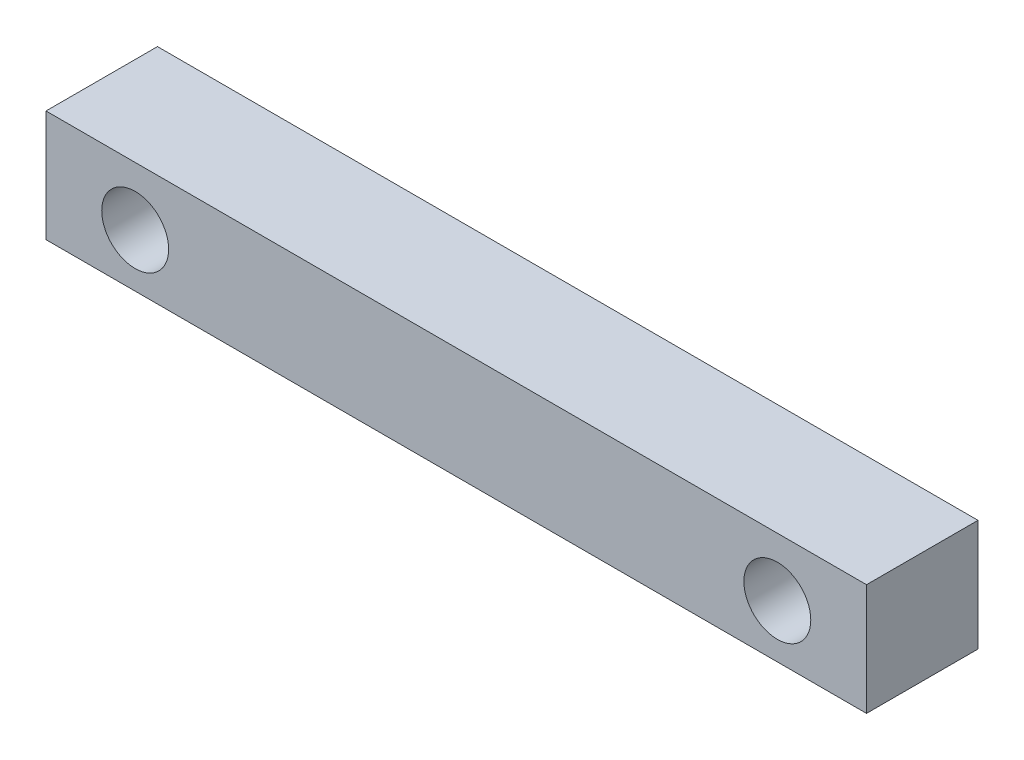
ISO-10303-21;
HEADER;
FILE_DESCRIPTION(('STEP AP214'),'2;1');
FILE_NAME('part.step','',(''),(''),'','','');
FILE_SCHEMA(('AUTOMOTIVE_DESIGN { 1 0 10303 214 1 1 1 1 }'));
ENDSEC;
DATA;
#1=APPLICATION_CONTEXT('core data for automotive mechanical design processes');
#2=APPLICATION_PROTOCOL_DEFINITION('international standard','automotive_design',2000,#1);
#3=PRODUCT_CONTEXT('',#1,'mechanical');
#4=PRODUCT('Part','Part','',(#3));
#5=PRODUCT_RELATED_PRODUCT_CATEGORY('part','',(#4));
#6=PRODUCT_DEFINITION_FORMATION('','',#4);
#7=PRODUCT_DEFINITION_CONTEXT('part definition',#1,'design');
#8=PRODUCT_DEFINITION('design','',#6,#7);
#9=PRODUCT_DEFINITION_SHAPE('','',#8);
#10=(LENGTH_UNIT() NAMED_UNIT(*) SI_UNIT(.MILLI.,.METRE.));
#11=(NAMED_UNIT(*) PLANE_ANGLE_UNIT() SI_UNIT($,.RADIAN.));
#12=(NAMED_UNIT(*) SI_UNIT($,.STERADIAN.) SOLID_ANGLE_UNIT());
#13=UNCERTAINTY_MEASURE_WITH_UNIT(LENGTH_MEASURE(1.E-05),#10,'distance_accuracy_value','');
#14=(GEOMETRIC_REPRESENTATION_CONTEXT(3) GLOBAL_UNCERTAINTY_ASSIGNED_CONTEXT((#13)) GLOBAL_UNIT_ASSIGNED_CONTEXT((#10,
#11,#12)) REPRESENTATION_CONTEXT('',''));
#15=CARTESIAN_POINT('',(0.,0.,0.));
#16=DIRECTION('',(0.,0.,1.));
#17=DIRECTION('',(1.,0.,0.));
#18=AXIS2_PLACEMENT_3D('',#15,#16,#17);
#19=CARTESIAN_POINT('',(92.,-11.8843075037593,25.));
#20=DIRECTION('',(-1.,0.,0.));
#21=DIRECTION('',(0.,0.,1.));
#22=AXIS2_PLACEMENT_3D('',#19,#20,#21);
#23=PLANE('',#22);
#24=DIRECTION('',(0.,1.,0.));
#25=VECTOR('',#24,1.);
#26=CARTESIAN_POINT('',(92.,-11.8843075037593,0.));
#27=LINE('',#26,#25);
#28=CARTESIAN_POINT('',(92.,-11.8843075037593,0.));
#29=VERTEX_POINT('',#28);
#30=CARTESIAN_POINT('',(92.,13.1156924962407,0.));
#31=VERTEX_POINT('',#30);
#32=EDGE_CURVE('E106',#29,#31,#27,.T.);
#33=ORIENTED_EDGE('',*,*,#32,.T.);
#34=DIRECTION('',(0.,0.,-1.));
#35=VECTOR('',#34,1.);
#36=CARTESIAN_POINT('',(92.,13.1156924962407,25.));
#37=LINE('',#36,#35);
#38=CARTESIAN_POINT('',(92.,13.1156924962407,25.));
#39=VERTEX_POINT('',#38);
#40=EDGE_CURVE('E11',#39,#31,#37,.T.);
#41=ORIENTED_EDGE('',*,*,#40,.F.);
#42=DIRECTION('',(0.,1.,0.));
#43=VECTOR('',#42,1.);
#44=CARTESIAN_POINT('',(92.,-11.8843075037593,25.));
#45=LINE('',#44,#43);
#46=CARTESIAN_POINT('',(92.,-11.8843075037593,25.));
#47=VERTEX_POINT('',#46);
#48=EDGE_CURVE('E90',#47,#39,#45,.T.);
#49=ORIENTED_EDGE('',*,*,#48,.F.);
#50=DIRECTION('',(0.,0.,-1.));
#51=VECTOR('',#50,1.);
#52=CARTESIAN_POINT('',(92.,-11.8843075037593,25.));
#53=LINE('',#52,#51);
#54=EDGE_CURVE('E102',#47,#29,#53,.T.);
#55=ORIENTED_EDGE('',*,*,#54,.T.);
#56=EDGE_LOOP('',(#33,#41,#49,#55));
#57=FACE_BOUND('',#56,.T.);
#58=ADVANCED_FACE('F38',(#57),#23,.F.);
#59=CARTESIAN_POINT('',(-92.,13.1156924962407,25.));
#60=DIRECTION('',(0.,-1.,0.));
#61=DIRECTION('',(0.,0.,-1.));
#62=AXIS2_PLACEMENT_3D('',#59,#60,#61);
#63=PLANE('',#62);
#64=DIRECTION('',(-1.,0.,0.));
#65=VECTOR('',#64,1.);
#66=CARTESIAN_POINT('',(-92.,13.1156924962407,0.));
#67=LINE('',#66,#65);
#68=CARTESIAN_POINT('',(-92.,13.1156924962407,0.));
#69=VERTEX_POINT('',#68);
#70=EDGE_CURVE('E95',#31,#69,#67,.T.);
#71=ORIENTED_EDGE('',*,*,#70,.T.);
#72=DIRECTION('',(0.,0.,-1.));
#73=VECTOR('',#72,1.);
#74=CARTESIAN_POINT('',(-92.,13.1156924962407,25.));
#75=LINE('',#74,#73);
#76=CARTESIAN_POINT('',(-92.,13.1156924962407,25.));
#77=VERTEX_POINT('',#76);
#78=EDGE_CURVE('E47',#77,#69,#75,.T.);
#79=ORIENTED_EDGE('',*,*,#78,.F.);
#80=DIRECTION('',(-1.,0.,0.));
#81=VECTOR('',#80,1.);
#82=CARTESIAN_POINT('',(-92.,13.1156924962407,25.));
#83=LINE('',#82,#81);
#84=EDGE_CURVE('E85',#39,#77,#83,.T.);
#85=ORIENTED_EDGE('',*,*,#84,.F.);
#86=ORIENTED_EDGE('',*,*,#40,.T.);
#87=EDGE_LOOP('',(#71,#79,#85,#86));
#88=FACE_BOUND('',#87,.T.);
#89=ADVANCED_FACE('F94',(#88),#63,.F.);
#90=CARTESIAN_POINT('',(-92.,-11.8843075037593,25.));
#91=DIRECTION('',(1.,0.,0.));
#92=DIRECTION('',(0.,0.,-1.));
#93=AXIS2_PLACEMENT_3D('',#90,#91,#92);
#94=PLANE('',#93);
#95=DIRECTION('',(0.,-1.,0.));
#96=VECTOR('',#95,1.);
#97=CARTESIAN_POINT('',(-92.,-11.8843075037593,0.));
#98=LINE('',#97,#96);
#99=CARTESIAN_POINT('',(-92.,-11.8843075037593,0.));
#100=VERTEX_POINT('',#99);
#101=EDGE_CURVE('E72',#69,#100,#98,.T.);
#102=ORIENTED_EDGE('',*,*,#101,.T.);
#103=DIRECTION('',(0.,0.,-1.));
#104=VECTOR('',#103,1.);
#105=CARTESIAN_POINT('',(-92.,-11.8843075037593,25.));
#106=LINE('',#105,#104);
#107=CARTESIAN_POINT('',(-92.,-11.8843075037593,25.));
#108=VERTEX_POINT('',#107);
#109=EDGE_CURVE('E97',#108,#100,#106,.T.);
#110=ORIENTED_EDGE('',*,*,#109,.F.);
#111=DIRECTION('',(0.,-1.,0.));
#112=VECTOR('',#111,1.);
#113=CARTESIAN_POINT('',(-92.,-11.8843075037593,25.));
#114=LINE('',#113,#112);
#115=EDGE_CURVE('E88',#77,#108,#114,.T.);
#116=ORIENTED_EDGE('',*,*,#115,.F.);
#117=ORIENTED_EDGE('',*,*,#78,.T.);
#118=EDGE_LOOP('',(#102,#110,#116,#117));
#119=FACE_BOUND('',#118,.T.);
#120=ADVANCED_FACE('F98',(#119),#94,.F.);
#121=CARTESIAN_POINT('',(-92.,-11.8843075037593,25.));
#122=DIRECTION('',(0.,1.,0.));
#123=DIRECTION('',(0.,0.,1.));
#124=AXIS2_PLACEMENT_3D('',#121,#122,#123);
#125=PLANE('',#124);
#126=DIRECTION('',(1.,0.,0.));
#127=VECTOR('',#126,1.);
#128=CARTESIAN_POINT('',(-92.,-11.8843075037593,0.));
#129=LINE('',#128,#127);
#130=EDGE_CURVE('E78',#100,#29,#129,.T.);
#131=ORIENTED_EDGE('',*,*,#130,.T.);
#132=ORIENTED_EDGE('',*,*,#54,.F.);
#133=DIRECTION('',(1.,0.,0.));
#134=VECTOR('',#133,1.);
#135=CARTESIAN_POINT('',(-92.,-11.8843075037593,25.));
#136=LINE('',#135,#134);
#137=EDGE_CURVE('E55',#108,#47,#136,.T.);
#138=ORIENTED_EDGE('',*,*,#137,.F.);
#139=ORIENTED_EDGE('',*,*,#109,.T.);
#140=EDGE_LOOP('',(#131,#132,#138,#139));
#141=FACE_BOUND('',#140,.T.);
#142=ADVANCED_FACE('F120',(#141),#125,.F.);
#143=CARTESIAN_POINT('',(0.,0.,25.));
#144=DIRECTION('',(0.,0.,-1.));
#145=DIRECTION('',(-1.,0.,0.));
#146=AXIS2_PLACEMENT_3D('',#143,#144,#145);
#147=PLANE('',#146);
#148=CARTESIAN_POINT('',(-72.,0.,25.));
#149=DIRECTION('',(0.,0.,-1.));
#150=DIRECTION('',(-1.,0.,0.));
#151=AXIS2_PLACEMENT_3D('',#148,#149,#150);
#152=CIRCLE('',#151,7.50000000000001);
#153=CARTESIAN_POINT('',(-79.5,0.,25.));
#154=VERTEX_POINT('',#153);
#155=EDGE_CURVE('E110',#154,#154,#152,.T.);
#156=ORIENTED_EDGE('',*,*,#155,.T.);
#157=EDGE_LOOP('',(#156));
#158=FACE_BOUND('',#157,.T.);
#159=CARTESIAN_POINT('',(72.,0.,25.));
#160=DIRECTION('',(0.,0.,-1.));
#161=DIRECTION('',(-1.,0.,0.));
#162=AXIS2_PLACEMENT_3D('',#159,#160,#161);
#163=CIRCLE('',#162,7.50000000000001);
#164=CARTESIAN_POINT('',(64.5,0.,25.));
#165=VERTEX_POINT('',#164);
#166=EDGE_CURVE('E130',#165,#165,#163,.T.);
#167=ORIENTED_EDGE('',*,*,#166,.T.);
#168=EDGE_LOOP('',(#167));
#169=FACE_BOUND('',#168,.T.);
#170=ORIENTED_EDGE('',*,*,#48,.T.);
#171=ORIENTED_EDGE('',*,*,#84,.T.);
#172=ORIENTED_EDGE('',*,*,#115,.T.);
#173=ORIENTED_EDGE('',*,*,#137,.T.);
#174=EDGE_LOOP('',(#170,#171,#172,#173));
#175=FACE_BOUND('',#174,.T.);
#176=ADVANCED_FACE('F86',(#158,#169,#175),#147,.F.);
#177=CARTESIAN_POINT('',(0.,0.,0.));
#178=DIRECTION('',(0.,0.,-1.));
#179=DIRECTION('',(-1.,0.,0.));
#180=AXIS2_PLACEMENT_3D('',#177,#178,#179);
#181=PLANE('',#180);
#182=CARTESIAN_POINT('',(-72.,0.,0.));
#183=DIRECTION('',(0.,0.,1.));
#184=DIRECTION('',(1.,0.,0.));
#185=AXIS2_PLACEMENT_3D('',#182,#183,#184);
#186=CIRCLE('',#185,7.50000000000001);
#187=CARTESIAN_POINT('',(-64.5,0.,0.));
#188=VERTEX_POINT('',#187);
#189=EDGE_CURVE('E134',#188,#188,#186,.T.);
#190=ORIENTED_EDGE('',*,*,#189,.T.);
#191=EDGE_LOOP('',(#190));
#192=FACE_BOUND('',#191,.T.);
#193=CARTESIAN_POINT('',(72.,0.,0.));
#194=DIRECTION('',(0.,0.,1.));
#195=DIRECTION('',(1.,0.,0.));
#196=AXIS2_PLACEMENT_3D('',#193,#194,#195);
#197=CIRCLE('',#196,7.50000000000001);
#198=CARTESIAN_POINT('',(79.5,0.,0.));
#199=VERTEX_POINT('',#198);
#200=EDGE_CURVE('E135',#199,#199,#197,.T.);
#201=ORIENTED_EDGE('',*,*,#200,.T.);
#202=EDGE_LOOP('',(#201));
#203=FACE_BOUND('',#202,.T.);
#204=ORIENTED_EDGE('',*,*,#32,.F.);
#205=ORIENTED_EDGE('',*,*,#130,.F.);
#206=ORIENTED_EDGE('',*,*,#101,.F.);
#207=ORIENTED_EDGE('',*,*,#70,.F.);
#208=EDGE_LOOP('',(#204,#205,#206,#207));
#209=FACE_BOUND('',#208,.T.);
#210=ADVANCED_FACE('F123',(#192,#203,#209),#181,.T.);
#211=CARTESIAN_POINT('',(72.,0.,0.));
#212=DIRECTION('',(0.,0.,1.));
#213=DIRECTION('',(1.,0.,0.));
#214=AXIS2_PLACEMENT_3D('',#211,#212,#213);
#215=CYLINDRICAL_SURFACE('',#214,7.50000000000001);
#216=ORIENTED_EDGE('',*,*,#200,.F.);
#217=EDGE_LOOP('',(#216));
#218=FACE_BOUND('',#217,.T.);
#219=ORIENTED_EDGE('',*,*,#166,.F.);
#220=EDGE_LOOP('',(#219));
#221=FACE_BOUND('',#220,.T.);
#222=ADVANCED_FACE('F148',(#218,#221),#215,.F.);
#223=CARTESIAN_POINT('',(-72.,0.,0.));
#224=DIRECTION('',(0.,0.,1.));
#225=DIRECTION('',(1.,0.,0.));
#226=AXIS2_PLACEMENT_3D('',#223,#224,#225);
#227=CYLINDRICAL_SURFACE('',#226,7.50000000000001);
#228=ORIENTED_EDGE('',*,*,#189,.F.);
#229=EDGE_LOOP('',(#228));
#230=FACE_BOUND('',#229,.T.);
#231=ORIENTED_EDGE('',*,*,#155,.F.);
#232=EDGE_LOOP('',(#231));
#233=FACE_BOUND('',#232,.T.);
#234=ADVANCED_FACE('F145',(#230,#233),#227,.F.);
#235=CLOSED_SHELL('',(#58,#89,#120,#142,#176,#210,#222,#234));
#236=MANIFOLD_SOLID_BREP('B2',#235);
#237=ADVANCED_BREP_SHAPE_REPRESENTATION('',(#18,#236),#14);
#238=SHAPE_DEFINITION_REPRESENTATION(#9,#237);
ENDSEC;
END-ISO-10303-21;
